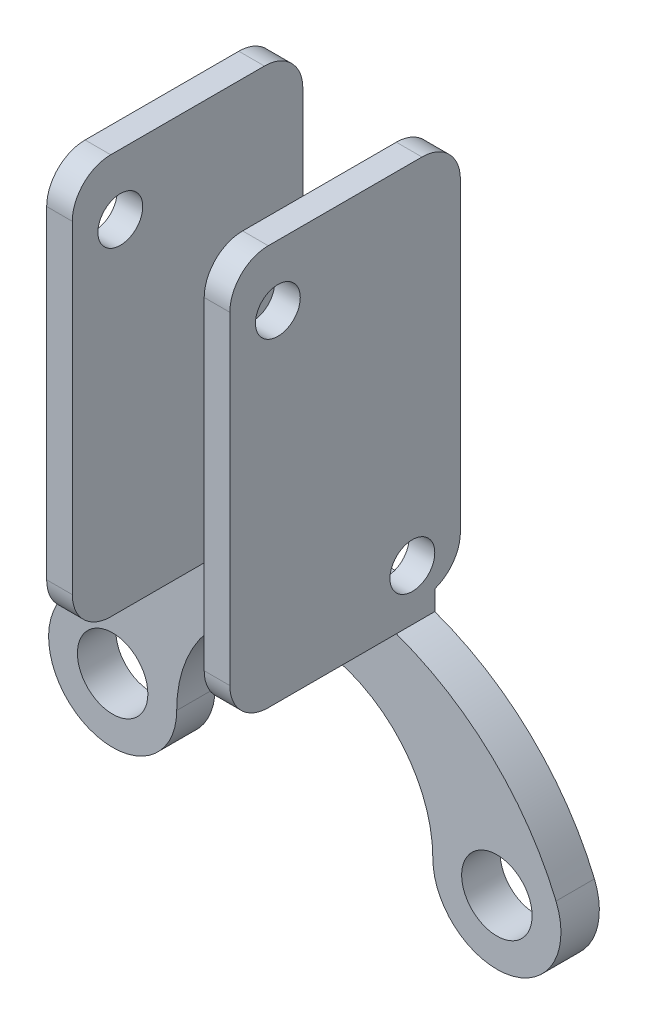
ISO-10303-21;
HEADER;
FILE_DESCRIPTION(('STEP AP214'),'2;1');
FILE_NAME('part.step','',(''),(''),'','','');
FILE_SCHEMA(('AUTOMOTIVE_DESIGN { 1 0 10303 214 1 1 1 1 }'));
ENDSEC;
DATA;
#1=APPLICATION_CONTEXT('core data for automotive mechanical design processes');
#2=APPLICATION_PROTOCOL_DEFINITION('international standard','automotive_design',2000,#1);
#3=PRODUCT_CONTEXT('',#1,'mechanical');
#4=PRODUCT('Part','Part','',(#3));
#5=PRODUCT_RELATED_PRODUCT_CATEGORY('part','',(#4));
#6=PRODUCT_DEFINITION_FORMATION('','',#4);
#7=PRODUCT_DEFINITION_CONTEXT('part definition',#1,'design');
#8=PRODUCT_DEFINITION('design','',#6,#7);
#9=PRODUCT_DEFINITION_SHAPE('','',#8);
#10=(LENGTH_UNIT() NAMED_UNIT(*) SI_UNIT(.MILLI.,.METRE.));
#11=(NAMED_UNIT(*) PLANE_ANGLE_UNIT() SI_UNIT($,.RADIAN.));
#12=(NAMED_UNIT(*) SI_UNIT($,.STERADIAN.) SOLID_ANGLE_UNIT());
#13=UNCERTAINTY_MEASURE_WITH_UNIT(LENGTH_MEASURE(1.E-05),#10,'distance_accuracy_value','');
#14=(GEOMETRIC_REPRESENTATION_CONTEXT(3) GLOBAL_UNCERTAINTY_ASSIGNED_CONTEXT((#13)) GLOBAL_UNIT_ASSIGNED_CONTEXT((#10,
#11,#12)) REPRESENTATION_CONTEXT('',''));
#15=CARTESIAN_POINT('',(0.,0.,0.));
#16=DIRECTION('',(0.,0.,1.));
#17=DIRECTION('',(1.,0.,0.));
#18=AXIS2_PLACEMENT_3D('',#15,#16,#17);
#19=CARTESIAN_POINT('',(0.,0.,0.));
#20=DIRECTION('',(0.,0.,1.));
#21=DIRECTION('',(1.,0.,0.));
#22=AXIS2_PLACEMENT_3D('',#19,#20,#21);
#23=PLANE('',#22);
#24=CARTESIAN_POINT('',(-15.,45.,0.));
#25=DIRECTION('',(0.,0.,1.));
#26=DIRECTION('',(1.,0.,0.));
#27=AXIS2_PLACEMENT_3D('',#24,#25,#26);
#28=CIRCLE('',#27,2.75);
#29=CARTESIAN_POINT('',(-12.25,45.,0.));
#30=VERTEX_POINT('',#29);
#31=EDGE_CURVE('E347',#30,#30,#28,.F.);
#32=ORIENTED_EDGE('',*,*,#31,.F.);
#33=EDGE_LOOP('',(#32));
#34=FACE_BOUND('',#33,.T.);
#35=CARTESIAN_POINT('',(15.,45.,0.));
#36=DIRECTION('',(0.,0.,1.));
#37=DIRECTION('',(1.,0.,0.));
#38=AXIS2_PLACEMENT_3D('',#35,#36,#37);
#39=CIRCLE('',#38,2.75);
#40=CARTESIAN_POINT('',(17.75,45.,0.));
#41=VERTEX_POINT('',#40);
#42=EDGE_CURVE('E343',#41,#41,#39,.F.);
#43=ORIENTED_EDGE('',*,*,#42,.F.);
#44=EDGE_LOOP('',(#43));
#45=FACE_BOUND('',#44,.T.);
#46=DIRECTION('',(-1.,0.,0.));
#47=VECTOR('',#46,1.);
#48=CARTESIAN_POINT('',(-5.15,60.3,0.));
#49=LINE('',#48,#47);
#50=CARTESIAN_POINT('',(-5.15,60.3,0.));
#51=VERTEX_POINT('',#50);
#52=CARTESIAN_POINT('',(-7.15,60.3,0.));
#53=VERTEX_POINT('',#52);
#54=EDGE_CURVE('E202',#51,#53,#49,.T.);
#55=ORIENTED_EDGE('',*,*,#54,.F.);
#56=DIRECTION('',(0.,1.,0.));
#57=VECTOR('',#56,1.);
#58=CARTESIAN_POINT('',(-5.15000000000001,0.,0.));
#59=LINE('',#58,#57);
#60=CARTESIAN_POINT('',(-5.15,60.,0.));
#61=VERTEX_POINT('',#60);
#62=EDGE_CURVE('E205',#61,#51,#59,.T.);
#63=ORIENTED_EDGE('',*,*,#62,.F.);
#64=DIRECTION('',(-1.,0.,0.));
#65=VECTOR('',#64,1.);
#66=CARTESIAN_POINT('',(0.,60.,0.));
#67=LINE('',#66,#65);
#68=CARTESIAN_POINT('',(5.15,60.,0.));
#69=VERTEX_POINT('',#68);
#70=EDGE_CURVE('E222',#69,#61,#67,.T.);
#71=ORIENTED_EDGE('',*,*,#70,.F.);
#72=DIRECTION('',(0.,1.,0.));
#73=VECTOR('',#72,1.);
#74=CARTESIAN_POINT('',(5.14999999999999,0.,0.));
#75=LINE('',#74,#73);
#76=CARTESIAN_POINT('',(5.14999999999999,60.3,0.));
#77=VERTEX_POINT('',#76);
#78=EDGE_CURVE('E362',#69,#77,#75,.T.);
#79=ORIENTED_EDGE('',*,*,#78,.T.);
#80=DIRECTION('',(-1.,0.,0.));
#81=VECTOR('',#80,1.);
#82=CARTESIAN_POINT('',(7.15,60.3,0.));
#83=LINE('',#82,#81);
#84=CARTESIAN_POINT('',(7.15,60.3,0.));
#85=VERTEX_POINT('',#84);
#86=EDGE_CURVE('E416',#85,#77,#83,.T.);
#87=ORIENTED_EDGE('',*,*,#86,.F.);
#88=DIRECTION('',(0.,1.,0.));
#89=VECTOR('',#88,1.);
#90=CARTESIAN_POINT('',(7.15,0.,0.));
#91=LINE('',#90,#89);
#92=CARTESIAN_POINT('',(7.15,58.7609969766626,0.));
#93=VERTEX_POINT('',#92);
#94=EDGE_CURVE('E365',#93,#85,#91,.T.);
#95=ORIENTED_EDGE('',*,*,#94,.F.);
#96=CARTESIAN_POINT('',(0.,38.75,0.));
#97=DIRECTION('',(0.,0.,1.));
#98=DIRECTION('',(1.,0.,0.));
#99=AXIS2_PLACEMENT_3D('',#96,#97,#98);
#100=CIRCLE('',#99,21.25);
#101=CARTESIAN_POINT('',(19.6153846153846,46.9230769230769,0.));
#102=VERTEX_POINT('',#101);
#103=EDGE_CURVE('E368',#102,#93,#100,.T.);
#104=ORIENTED_EDGE('',*,*,#103,.F.);
#105=CARTESIAN_POINT('',(15.,45.,0.));
#106=DIRECTION('',(0.,0.,1.));
#107=DIRECTION('',(1.,0.,0.));
#108=AXIS2_PLACEMENT_3D('',#105,#106,#107);
#109=CIRCLE('',#108,5.);
#110=CARTESIAN_POINT('',(10.,45.,0.));
#111=VERTEX_POINT('',#110);
#112=EDGE_CURVE('E350',#111,#102,#109,.T.);
#113=ORIENTED_EDGE('',*,*,#112,.F.);
#114=CARTESIAN_POINT('',(0.,45.,0.));
#115=DIRECTION('',(0.,0.,1.));
#116=DIRECTION('',(1.,0.,0.));
#117=AXIS2_PLACEMENT_3D('',#114,#115,#116);
#118=CIRCLE('',#117,10.);
#119=CARTESIAN_POINT('',(-10.,45.,0.));
#120=VERTEX_POINT('',#119);
#121=EDGE_CURVE('E352',#111,#120,#118,.T.);
#122=ORIENTED_EDGE('',*,*,#121,.T.);
#123=CARTESIAN_POINT('',(-15.,45.,0.));
#124=DIRECTION('',(0.,0.,1.));
#125=DIRECTION('',(1.,0.,0.));
#126=AXIS2_PLACEMENT_3D('',#123,#124,#125);
#127=CIRCLE('',#126,5.);
#128=CARTESIAN_POINT('',(-19.6153846153846,46.9230769230769,0.));
#129=VERTEX_POINT('',#128);
#130=EDGE_CURVE('E355',#129,#120,#127,.T.);
#131=ORIENTED_EDGE('',*,*,#130,.F.);
#132=CARTESIAN_POINT('',(0.,38.75,0.));
#133=DIRECTION('',(0.,0.,1.));
#134=DIRECTION('',(1.,0.,0.));
#135=AXIS2_PLACEMENT_3D('',#132,#133,#134);
#136=CIRCLE('',#135,21.25);
#137=CARTESIAN_POINT('',(-7.15,58.7609969766626,0.));
#138=VERTEX_POINT('',#137);
#139=EDGE_CURVE('E358',#138,#129,#136,.T.);
#140=ORIENTED_EDGE('',*,*,#139,.F.);
#141=DIRECTION('',(0.,-1.,0.));
#142=VECTOR('',#141,1.);
#143=CARTESIAN_POINT('',(-7.15,0.,0.));
#144=LINE('',#143,#142);
#145=EDGE_CURVE('E207',#53,#138,#144,.T.);
#146=ORIENTED_EDGE('',*,*,#145,.F.);
#147=EDGE_LOOP('',(#55,#63,#71,#79,#87,#95,#104,#113,#122,#131,#140,#146));
#148=FACE_BOUND('',#147,.T.);
#149=ADVANCED_FACE('F35',(#34,#45,#148),#23,.F.);
#150=CARTESIAN_POINT('',(0.,0.,3.));
#151=DIRECTION('',(0.,0.,1.));
#152=DIRECTION('',(1.,0.,0.));
#153=AXIS2_PLACEMENT_3D('',#150,#151,#152);
#154=PLANE('',#153);
#155=CARTESIAN_POINT('',(-15.,45.,3.));
#156=DIRECTION('',(0.,0.,1.));
#157=DIRECTION('',(1.,0.,0.));
#158=AXIS2_PLACEMENT_3D('',#155,#156,#157);
#159=CIRCLE('',#158,2.75);
#160=CARTESIAN_POINT('',(-12.25,45.,3.));
#161=VERTEX_POINT('',#160);
#162=EDGE_CURVE('E374',#161,#161,#159,.F.);
#163=ORIENTED_EDGE('',*,*,#162,.T.);
#164=EDGE_LOOP('',(#163));
#165=FACE_BOUND('',#164,.T.);
#166=CARTESIAN_POINT('',(15.,45.,3.));
#167=DIRECTION('',(0.,0.,1.));
#168=DIRECTION('',(1.,0.,0.));
#169=AXIS2_PLACEMENT_3D('',#166,#167,#168);
#170=CIRCLE('',#169,2.75);
#171=CARTESIAN_POINT('',(17.75,45.,3.));
#172=VERTEX_POINT('',#171);
#173=EDGE_CURVE('E342',#172,#172,#170,.F.);
#174=ORIENTED_EDGE('',*,*,#173,.T.);
#175=EDGE_LOOP('',(#174));
#176=FACE_BOUND('',#175,.T.);
#177=DIRECTION('',(1.,0.,0.));
#178=VECTOR('',#177,1.);
#179=CARTESIAN_POINT('',(7.15,58.7609969766626,3.));
#180=LINE('',#179,#178);
#181=CARTESIAN_POINT('',(5.15,58.7609969766626,3.));
#182=VERTEX_POINT('',#181);
#183=CARTESIAN_POINT('',(7.15,58.7609969766626,3.));
#184=VERTEX_POINT('',#183);
#185=EDGE_CURVE('E408',#182,#184,#180,.T.);
#186=ORIENTED_EDGE('',*,*,#185,.F.);
#187=DIRECTION('',(0.,1.,0.));
#188=VECTOR('',#187,1.);
#189=CARTESIAN_POINT('',(5.15,0.,3.));
#190=LINE('',#189,#188);
#191=CARTESIAN_POINT('',(5.15,60.,3.));
#192=VERTEX_POINT('',#191);
#193=EDGE_CURVE('E304',#182,#192,#190,.T.);
#194=ORIENTED_EDGE('',*,*,#193,.T.);
#195=DIRECTION('',(-1.,0.,0.));
#196=VECTOR('',#195,1.);
#197=CARTESIAN_POINT('',(0.,60.,3.));
#198=LINE('',#197,#196);
#199=CARTESIAN_POINT('',(-5.15,60.,3.));
#200=VERTEX_POINT('',#199);
#201=EDGE_CURVE('E386',#192,#200,#198,.T.);
#202=ORIENTED_EDGE('',*,*,#201,.T.);
#203=DIRECTION('',(0.,1.,0.));
#204=VECTOR('',#203,1.);
#205=CARTESIAN_POINT('',(-5.15,58.7609969766626,3.));
#206=LINE('',#205,#204);
#207=CARTESIAN_POINT('',(-5.15,58.7609969766626,3.));
#208=VERTEX_POINT('',#207);
#209=EDGE_CURVE('E394',#208,#200,#206,.T.);
#210=ORIENTED_EDGE('',*,*,#209,.F.);
#211=DIRECTION('',(1.,0.,0.));
#212=VECTOR('',#211,1.);
#213=CARTESIAN_POINT('',(-7.15,58.7609969766626,3.));
#214=LINE('',#213,#212);
#215=CARTESIAN_POINT('',(-7.15,58.7609969766626,3.));
#216=VERTEX_POINT('',#215);
#217=EDGE_CURVE('E397',#216,#208,#214,.T.);
#218=ORIENTED_EDGE('',*,*,#217,.F.);
#219=CARTESIAN_POINT('',(0.,38.75,3.));
#220=DIRECTION('',(0.,0.,1.));
#221=DIRECTION('',(1.,0.,0.));
#222=AXIS2_PLACEMENT_3D('',#219,#220,#221);
#223=CIRCLE('',#222,21.25);
#224=CARTESIAN_POINT('',(-19.6153846153846,46.9230769230769,3.));
#225=VERTEX_POINT('',#224);
#226=EDGE_CURVE('E384',#216,#225,#223,.T.);
#227=ORIENTED_EDGE('',*,*,#226,.T.);
#228=CARTESIAN_POINT('',(-15.,45.,3.));
#229=DIRECTION('',(0.,0.,1.));
#230=DIRECTION('',(1.,0.,0.));
#231=AXIS2_PLACEMENT_3D('',#228,#229,#230);
#232=CIRCLE('',#231,5.);
#233=CARTESIAN_POINT('',(-10.,45.,3.));
#234=VERTEX_POINT('',#233);
#235=EDGE_CURVE('E382',#225,#234,#232,.T.);
#236=ORIENTED_EDGE('',*,*,#235,.T.);
#237=CARTESIAN_POINT('',(0.,45.,3.));
#238=DIRECTION('',(0.,0.,1.));
#239=DIRECTION('',(1.,0.,0.));
#240=AXIS2_PLACEMENT_3D('',#237,#238,#239);
#241=CIRCLE('',#240,10.);
#242=CARTESIAN_POINT('',(10.,45.,3.));
#243=VERTEX_POINT('',#242);
#244=EDGE_CURVE('E379',#243,#234,#241,.T.);
#245=ORIENTED_EDGE('',*,*,#244,.F.);
#246=CARTESIAN_POINT('',(15.,45.,3.));
#247=DIRECTION('',(0.,0.,1.));
#248=DIRECTION('',(1.,0.,0.));
#249=AXIS2_PLACEMENT_3D('',#246,#247,#248);
#250=CIRCLE('',#249,5.);
#251=CARTESIAN_POINT('',(19.6153846153846,46.9230769230769,3.));
#252=VERTEX_POINT('',#251);
#253=EDGE_CURVE('E377',#243,#252,#250,.T.);
#254=ORIENTED_EDGE('',*,*,#253,.T.);
#255=CARTESIAN_POINT('',(0.,38.75,3.));
#256=DIRECTION('',(0.,0.,1.));
#257=DIRECTION('',(1.,0.,0.));
#258=AXIS2_PLACEMENT_3D('',#255,#256,#257);
#259=CIRCLE('',#258,21.25);
#260=EDGE_CURVE('E346',#252,#184,#259,.T.);
#261=ORIENTED_EDGE('',*,*,#260,.T.);
#262=EDGE_LOOP('',(#186,#194,#202,#210,#218,#227,#236,#245,#254,#261));
#263=FACE_BOUND('',#262,.T.);
#264=ADVANCED_FACE('F490',(#165,#176,#263),#154,.T.);
#265=CARTESIAN_POINT('',(0.,38.75,3.));
#266=DIRECTION('',(0.,0.,-1.));
#267=DIRECTION('',(-1.,0.,0.));
#268=AXIS2_PLACEMENT_3D('',#265,#266,#267);
#269=CYLINDRICAL_SURFACE('',#268,21.25);
#270=ORIENTED_EDGE('',*,*,#103,.T.);
#271=DIRECTION('',(0.,0.,-1.));
#272=VECTOR('',#271,1.);
#273=CARTESIAN_POINT('',(7.15,58.7609969766626,3.));
#274=LINE('',#273,#272);
#275=EDGE_CURVE('E316',#184,#93,#274,.T.);
#276=ORIENTED_EDGE('',*,*,#275,.F.);
#277=ORIENTED_EDGE('',*,*,#260,.F.);
#278=DIRECTION('',(0.,0.,-1.));
#279=VECTOR('',#278,1.);
#280=CARTESIAN_POINT('',(19.6153846153846,46.9230769230769,3.));
#281=LINE('',#280,#279);
#282=EDGE_CURVE('E339',#252,#102,#281,.T.);
#283=ORIENTED_EDGE('',*,*,#282,.T.);
#284=EDGE_LOOP('',(#270,#276,#277,#283));
#285=FACE_BOUND('',#284,.T.);
#286=ADVANCED_FACE('F448',(#285),#269,.T.);
#287=CARTESIAN_POINT('',(7.15,0.,3.));
#288=DIRECTION('',(-1.,0.,0.));
#289=DIRECTION('',(0.,0.,1.));
#290=AXIS2_PLACEMENT_3D('',#287,#288,#289);
#291=PLANE('',#290);
#292=CARTESIAN_POINT('',(7.15,62.7499999999999,1.74999999999999));
#293=DIRECTION('',(1.,0.,0.));
#294=DIRECTION('',(0.,0.,-1.));
#295=AXIS2_PLACEMENT_3D('',#292,#293,#294);
#296=CIRCLE('',#295,1.75);
#297=CARTESIAN_POINT('',(7.15,62.7499999999999,0.));
#298=VERTEX_POINT('',#297);
#299=EDGE_CURVE('E314',#298,#298,#296,.T.);
#300=ORIENTED_EDGE('',*,*,#299,.F.);
#301=EDGE_LOOP('',(#300));
#302=FACE_BOUND('',#301,.T.);
#303=CARTESIAN_POINT('',(7.15,85.2499999999999,12.25));
#304=DIRECTION('',(1.,0.,0.));
#305=DIRECTION('',(0.,0.,-1.));
#306=AXIS2_PLACEMENT_3D('',#303,#304,#305);
#307=CIRCLE('',#306,1.75);
#308=CARTESIAN_POINT('',(7.15,85.2499999999999,10.5));
#309=VERTEX_POINT('',#308);
#310=EDGE_CURVE('E436',#309,#309,#307,.T.);
#311=ORIENTED_EDGE('',*,*,#310,.F.);
#312=EDGE_LOOP('',(#311));
#313=FACE_BOUND('',#312,.T.);
#314=ORIENTED_EDGE('',*,*,#94,.T.);
#315=CARTESIAN_POINT('',(7.15,63.1284271247462,1.));
#316=DIRECTION('',(-1.,0.,0.));
#317=DIRECTION('',(0.,0.,1.));
#318=AXIS2_PLACEMENT_3D('',#315,#316,#317);
#319=CIRCLE('',#318,3.);
#320=CARTESIAN_POINT('',(7.15,63.1284271247462,-2.));
#321=VERTEX_POINT('',#320);
#322=EDGE_CURVE('E252',#85,#321,#319,.F.);
#323=ORIENTED_EDGE('',*,*,#322,.T.);
#324=DIRECTION('',(0.,-1.,0.));
#325=VECTOR('',#324,1.);
#326=CARTESIAN_POINT('',(7.15,90.,-2.));
#327=LINE('',#326,#325);
#328=CARTESIAN_POINT('',(7.15,87.,-2.));
#329=VERTEX_POINT('',#328);
#330=EDGE_CURVE('E419',#329,#321,#327,.T.);
#331=ORIENTED_EDGE('',*,*,#330,.F.);
#332=CARTESIAN_POINT('',(7.15,87.,1.));
#333=DIRECTION('',(-1.,0.,0.));
#334=DIRECTION('',(0.,0.,1.));
#335=AXIS2_PLACEMENT_3D('',#332,#333,#334);
#336=CIRCLE('',#335,3.);
#337=CARTESIAN_POINT('',(7.15,90.,1.));
#338=VERTEX_POINT('',#337);
#339=EDGE_CURVE('E249',#329,#338,#336,.F.);
#340=ORIENTED_EDGE('',*,*,#339,.T.);
#341=DIRECTION('',(0.,0.,-1.));
#342=VECTOR('',#341,1.);
#343=CARTESIAN_POINT('',(7.15,90.,3.));
#344=LINE('',#343,#342);
#345=CARTESIAN_POINT('',(7.15,90.,13.));
#346=VERTEX_POINT('',#345);
#347=EDGE_CURVE('E319',#346,#338,#344,.T.);
#348=ORIENTED_EDGE('',*,*,#347,.F.);
#349=CARTESIAN_POINT('',(7.15,87.,13.));
#350=DIRECTION('',(-1.,0.,0.));
#351=DIRECTION('',(0.,0.,1.));
#352=AXIS2_PLACEMENT_3D('',#349,#350,#351);
#353=CIRCLE('',#352,3.);
#354=CARTESIAN_POINT('',(7.15,87.,16.));
#355=VERTEX_POINT('',#354);
#356=EDGE_CURVE('E56',#346,#355,#353,.F.);
#357=ORIENTED_EDGE('',*,*,#356,.T.);
#358=DIRECTION('',(0.,1.,0.));
#359=VECTOR('',#358,1.);
#360=CARTESIAN_POINT('',(7.15,58.7609969766626,16.));
#361=LINE('',#360,#359);
#362=CARTESIAN_POINT('',(7.15,61.7609969766626,16.));
#363=VERTEX_POINT('',#362);
#364=EDGE_CURVE('E411',#363,#355,#361,.T.);
#365=ORIENTED_EDGE('',*,*,#364,.F.);
#366=CARTESIAN_POINT('',(7.15,61.7609969766626,13.));
#367=DIRECTION('',(-1.,0.,0.));
#368=DIRECTION('',(0.,0.,1.));
#369=AXIS2_PLACEMENT_3D('',#366,#367,#368);
#370=CIRCLE('',#369,3.);
#371=CARTESIAN_POINT('',(7.15,58.7609969766626,13.));
#372=VERTEX_POINT('',#371);
#373=EDGE_CURVE('E50',#363,#372,#370,.F.);
#374=ORIENTED_EDGE('',*,*,#373,.T.);
#375=DIRECTION('',(0.,0.,-1.));
#376=VECTOR('',#375,1.);
#377=CARTESIAN_POINT('',(7.15,58.7609969766626,16.));
#378=LINE('',#377,#376);
#379=EDGE_CURVE('E405',#372,#184,#378,.T.);
#380=ORIENTED_EDGE('',*,*,#379,.T.);
#381=ORIENTED_EDGE('',*,*,#275,.T.);
#382=EDGE_LOOP('',(#314,#323,#331,#340,#348,#357,#365,#374,#380,#381));
#383=FACE_BOUND('',#382,.T.);
#384=ADVANCED_FACE('F444',(#302,#313,#383),#291,.F.);
#385=CARTESIAN_POINT('',(0.,90.,3.));
#386=DIRECTION('',(0.,1.,0.));
#387=DIRECTION('',(0.,0.,1.));
#388=AXIS2_PLACEMENT_3D('',#385,#386,#387);
#389=PLANE('',#388);
#390=ORIENTED_EDGE('',*,*,#347,.T.);
#391=DIRECTION('',(1.,0.,0.));
#392=VECTOR('',#391,1.);
#393=CARTESIAN_POINT('',(0.,90.,1.));
#394=LINE('',#393,#392);
#395=CARTESIAN_POINT('',(5.15,90.,1.));
#396=VERTEX_POINT('',#395);
#397=EDGE_CURVE('E272',#338,#396,#394,.F.);
#398=ORIENTED_EDGE('',*,*,#397,.T.);
#399=DIRECTION('',(0.,0.,-1.));
#400=VECTOR('',#399,1.);
#401=CARTESIAN_POINT('',(5.15,90.,3.));
#402=LINE('',#401,#400);
#403=CARTESIAN_POINT('',(5.15,90.,13.));
#404=VERTEX_POINT('',#403);
#405=EDGE_CURVE('E322',#404,#396,#402,.T.);
#406=ORIENTED_EDGE('',*,*,#405,.F.);
#407=DIRECTION('',(-1.,0.,0.));
#408=VECTOR('',#407,1.);
#409=CARTESIAN_POINT('',(0.,90.,13.));
#410=LINE('',#409,#408);
#411=EDGE_CURVE('E270',#404,#346,#410,.F.);
#412=ORIENTED_EDGE('',*,*,#411,.T.);
#413=EDGE_LOOP('',(#390,#398,#406,#412));
#414=FACE_BOUND('',#413,.T.);
#415=ADVANCED_FACE('F447',(#414),#389,.T.);
#416=CARTESIAN_POINT('',(5.14999999999999,0.,3.));
#417=DIRECTION('',(-1.,0.,0.));
#418=DIRECTION('',(0.,-1.,0.));
#419=AXIS2_PLACEMENT_3D('',#416,#417,#418);
#420=PLANE('',#419);
#421=CARTESIAN_POINT('',(5.15,62.7499999999999,1.74999999999999));
#422=DIRECTION('',(-1.,0.,0.));
#423=DIRECTION('',(0.,-1.,0.));
#424=AXIS2_PLACEMENT_3D('',#421,#422,#423);
#425=CIRCLE('',#424,1.75);
#426=CARTESIAN_POINT('',(5.15,60.9999999999999,1.74999999999999));
#427=VERTEX_POINT('',#426);
#428=EDGE_CURVE('E211',#427,#427,#425,.T.);
#429=ORIENTED_EDGE('',*,*,#428,.F.);
#430=EDGE_LOOP('',(#429));
#431=FACE_BOUND('',#430,.T.);
#432=CARTESIAN_POINT('',(5.15,85.2499999999999,12.25));
#433=DIRECTION('',(-1.,0.,0.));
#434=DIRECTION('',(0.,-1.,0.));
#435=AXIS2_PLACEMENT_3D('',#432,#433,#434);
#436=CIRCLE('',#435,1.75);
#437=CARTESIAN_POINT('',(5.15,83.4999999999999,12.25));
#438=VERTEX_POINT('',#437);
#439=EDGE_CURVE('E309',#438,#438,#436,.T.);
#440=ORIENTED_EDGE('',*,*,#439,.F.);
#441=EDGE_LOOP('',(#440));
#442=FACE_BOUND('',#441,.T.);
#443=DIRECTION('',(0.,1.,0.));
#444=VECTOR('',#443,1.);
#445=CARTESIAN_POINT('',(5.15,90.,-2.));
#446=LINE('',#445,#444);
#447=CARTESIAN_POINT('',(5.15,63.1284271247462,-2.));
#448=VERTEX_POINT('',#447);
#449=CARTESIAN_POINT('',(5.15,87.,-2.));
#450=VERTEX_POINT('',#449);
#451=EDGE_CURVE('E412',#448,#450,#446,.T.);
#452=ORIENTED_EDGE('',*,*,#451,.F.);
#453=CARTESIAN_POINT('',(5.15,63.1284271247462,1.));
#454=DIRECTION('',(-1.,0.,0.));
#455=DIRECTION('',(0.,-1.,0.));
#456=AXIS2_PLACEMENT_3D('',#453,#454,#455);
#457=CIRCLE('',#456,3.);
#458=EDGE_CURVE('E246',#448,#77,#457,.T.);
#459=ORIENTED_EDGE('',*,*,#458,.T.);
#460=ORIENTED_EDGE('',*,*,#78,.F.);
#461=DIRECTION('',(0.,0.,-1.));
#462=VECTOR('',#461,1.);
#463=CARTESIAN_POINT('',(5.15,60.,3.));
#464=LINE('',#463,#462);
#465=EDGE_CURVE('E325',#192,#69,#464,.T.);
#466=ORIENTED_EDGE('',*,*,#465,.F.);
#467=ORIENTED_EDGE('',*,*,#193,.F.);
#468=DIRECTION('',(0.,0.,-1.));
#469=VECTOR('',#468,1.);
#470=CARTESIAN_POINT('',(5.15,58.7609969766626,16.));
#471=LINE('',#470,#469);
#472=CARTESIAN_POINT('',(5.15,58.7609969766626,13.));
#473=VERTEX_POINT('',#472);
#474=EDGE_CURVE('E400',#473,#182,#471,.T.);
#475=ORIENTED_EDGE('',*,*,#474,.F.);
#476=CARTESIAN_POINT('',(5.15,61.7609969766626,13.));
#477=DIRECTION('',(-1.,0.,0.));
#478=DIRECTION('',(0.,-1.,0.));
#479=AXIS2_PLACEMENT_3D('',#476,#477,#478);
#480=CIRCLE('',#479,3.);
#481=CARTESIAN_POINT('',(5.15,61.7609969766626,16.));
#482=VERTEX_POINT('',#481);
#483=EDGE_CURVE('E244',#473,#482,#480,.T.);
#484=ORIENTED_EDGE('',*,*,#483,.T.);
#485=DIRECTION('',(0.,-1.,0.));
#486=VECTOR('',#485,1.);
#487=CARTESIAN_POINT('',(5.15,58.7609969766626,16.));
#488=LINE('',#487,#486);
#489=CARTESIAN_POINT('',(5.15,87.,16.));
#490=VERTEX_POINT('',#489);
#491=EDGE_CURVE('E407',#490,#482,#488,.T.);
#492=ORIENTED_EDGE('',*,*,#491,.F.);
#493=CARTESIAN_POINT('',(5.15,87.,13.));
#494=DIRECTION('',(-1.,0.,0.));
#495=DIRECTION('',(0.,-1.,0.));
#496=AXIS2_PLACEMENT_3D('',#493,#494,#495);
#497=CIRCLE('',#496,3.);
#498=EDGE_CURVE('E240',#490,#404,#497,.T.);
#499=ORIENTED_EDGE('',*,*,#498,.T.);
#500=ORIENTED_EDGE('',*,*,#405,.T.);
#501=CARTESIAN_POINT('',(5.15,87.,1.));
#502=DIRECTION('',(-1.,0.,0.));
#503=DIRECTION('',(0.,-1.,0.));
#504=AXIS2_PLACEMENT_3D('',#501,#502,#503);
#505=CIRCLE('',#504,3.);
#506=EDGE_CURVE('E242',#396,#450,#505,.T.);
#507=ORIENTED_EDGE('',*,*,#506,.T.);
#508=EDGE_LOOP('',(#452,#459,#460,#466,#467,#475,#484,#492,#499,#500,#507));
#509=FACE_BOUND('',#508,.T.);
#510=ADVANCED_FACE('F463',(#431,#442,#509),#420,.T.);
#511=CARTESIAN_POINT('',(0.,60.,3.));
#512=DIRECTION('',(0.,-1.,0.));
#513=DIRECTION('',(0.,0.,-1.));
#514=AXIS2_PLACEMENT_3D('',#511,#512,#513);
#515=PLANE('',#514);
#516=ORIENTED_EDGE('',*,*,#70,.T.);
#517=DIRECTION('',(0.,0.,-1.));
#518=VECTOR('',#517,1.);
#519=CARTESIAN_POINT('',(-5.15,60.,3.));
#520=LINE('',#519,#518);
#521=EDGE_CURVE('E221',#200,#61,#520,.T.);
#522=ORIENTED_EDGE('',*,*,#521,.F.);
#523=ORIENTED_EDGE('',*,*,#201,.F.);
#524=ORIENTED_EDGE('',*,*,#465,.T.);
#525=EDGE_LOOP('',(#516,#522,#523,#524));
#526=FACE_BOUND('',#525,.T.);
#527=ADVANCED_FACE('F577',(#526),#515,.F.);
#528=CARTESIAN_POINT('',(-5.15000000000001,0.,3.));
#529=DIRECTION('',(-1.,0.,0.));
#530=DIRECTION('',(0.,-1.,0.));
#531=AXIS2_PLACEMENT_3D('',#528,#529,#530);
#532=PLANE('',#531);
#533=CARTESIAN_POINT('',(-5.15,62.7499999999999,1.74999999999999));
#534=DIRECTION('',(-1.,0.,0.));
#535=DIRECTION('',(0.,-1.,0.));
#536=AXIS2_PLACEMENT_3D('',#533,#534,#535);
#537=CIRCLE('',#536,1.75);
#538=CARTESIAN_POINT('',(-5.15,60.9999999999999,1.74999999999999));
#539=VERTEX_POINT('',#538);
#540=EDGE_CURVE('E308',#539,#539,#537,.T.);
#541=ORIENTED_EDGE('',*,*,#540,.T.);
#542=EDGE_LOOP('',(#541));
#543=FACE_BOUND('',#542,.T.);
#544=CARTESIAN_POINT('',(-5.15,85.2499999999999,12.25));
#545=DIRECTION('',(-1.,0.,0.));
#546=DIRECTION('',(0.,-1.,0.));
#547=AXIS2_PLACEMENT_3D('',#544,#545,#546);
#548=CIRCLE('',#547,1.75);
#549=CARTESIAN_POINT('',(-5.15,83.4999999999999,12.25));
#550=VERTEX_POINT('',#549);
#551=EDGE_CURVE('E313',#550,#550,#548,.T.);
#552=ORIENTED_EDGE('',*,*,#551,.T.);
#553=EDGE_LOOP('',(#552));
#554=FACE_BOUND('',#553,.T.);
#555=ORIENTED_EDGE('',*,*,#62,.T.);
#556=CARTESIAN_POINT('',(-5.15,63.1284271247462,1.));
#557=DIRECTION('',(-1.,0.,0.));
#558=DIRECTION('',(0.,-1.,0.));
#559=AXIS2_PLACEMENT_3D('',#556,#557,#558);
#560=CIRCLE('',#559,3.);
#561=CARTESIAN_POINT('',(-5.15,63.1284271247462,-2.));
#562=VERTEX_POINT('',#561);
#563=EDGE_CURVE('E217',#51,#562,#560,.F.);
#564=ORIENTED_EDGE('',*,*,#563,.T.);
#565=DIRECTION('',(0.,-1.,0.));
#566=VECTOR('',#565,1.);
#567=CARTESIAN_POINT('',(-5.15,60.3,-2.));
#568=LINE('',#567,#566);
#569=CARTESIAN_POINT('',(-5.15,87.,-2.));
#570=VERTEX_POINT('',#569);
#571=EDGE_CURVE('E210',#570,#562,#568,.T.);
#572=ORIENTED_EDGE('',*,*,#571,.F.);
#573=CARTESIAN_POINT('',(-5.15,87.,1.));
#574=DIRECTION('',(-1.,0.,0.));
#575=DIRECTION('',(0.,-1.,0.));
#576=AXIS2_PLACEMENT_3D('',#573,#574,#575);
#577=CIRCLE('',#576,3.);
#578=CARTESIAN_POINT('',(-5.15,90.,1.));
#579=VERTEX_POINT('',#578);
#580=EDGE_CURVE('E234',#570,#579,#577,.F.);
#581=ORIENTED_EDGE('',*,*,#580,.T.);
#582=DIRECTION('',(0.,0.,-1.));
#583=VECTOR('',#582,1.);
#584=CARTESIAN_POINT('',(-5.15,90.,3.));
#585=LINE('',#584,#583);
#586=CARTESIAN_POINT('',(-5.15,90.,13.));
#587=VERTEX_POINT('',#586);
#588=EDGE_CURVE('E279',#587,#579,#585,.T.);
#589=ORIENTED_EDGE('',*,*,#588,.F.);
#590=CARTESIAN_POINT('',(-5.15,87.,13.));
#591=DIRECTION('',(-1.,0.,0.));
#592=DIRECTION('',(0.,-1.,0.));
#593=AXIS2_PLACEMENT_3D('',#590,#591,#592);
#594=CIRCLE('',#593,3.);
#595=CARTESIAN_POINT('',(-5.15,87.,16.));
#596=VERTEX_POINT('',#595);
#597=EDGE_CURVE('E286',#587,#596,#594,.F.);
#598=ORIENTED_EDGE('',*,*,#597,.T.);
#599=DIRECTION('',(0.,1.,0.));
#600=VECTOR('',#599,1.);
#601=CARTESIAN_POINT('',(-5.15,58.7609969766626,16.));
#602=LINE('',#601,#600);
#603=CARTESIAN_POINT('',(-5.15,61.7609969766626,16.));
#604=VERTEX_POINT('',#603);
#605=EDGE_CURVE('E393',#604,#596,#602,.T.);
#606=ORIENTED_EDGE('',*,*,#605,.F.);
#607=CARTESIAN_POINT('',(-5.15,61.7609969766626,13.));
#608=DIRECTION('',(-1.,0.,0.));
#609=DIRECTION('',(0.,-1.,0.));
#610=AXIS2_PLACEMENT_3D('',#607,#608,#609);
#611=CIRCLE('',#610,3.);
#612=CARTESIAN_POINT('',(-5.15,58.7609969766626,13.));
#613=VERTEX_POINT('',#612);
#614=EDGE_CURVE('E229',#604,#613,#611,.F.);
#615=ORIENTED_EDGE('',*,*,#614,.T.);
#616=DIRECTION('',(0.,0.,-1.));
#617=VECTOR('',#616,1.);
#618=CARTESIAN_POINT('',(-5.15,58.7609969766626,16.));
#619=LINE('',#618,#617);
#620=EDGE_CURVE('E391',#613,#208,#619,.T.);
#621=ORIENTED_EDGE('',*,*,#620,.T.);
#622=ORIENTED_EDGE('',*,*,#209,.T.);
#623=ORIENTED_EDGE('',*,*,#521,.T.);
#624=EDGE_LOOP('',(#555,#564,#572,#581,#589,#598,#606,#615,#621,#622,#623));
#625=FACE_BOUND('',#624,.T.);
#626=ADVANCED_FACE('F215',(#543,#554,#625),#532,.F.);
#627=CARTESIAN_POINT('',(0.,90.,3.));
#628=DIRECTION('',(0.,-1.,0.));
#629=DIRECTION('',(0.,0.,-1.));
#630=AXIS2_PLACEMENT_3D('',#627,#628,#629);
#631=PLANE('',#630);
#632=ORIENTED_EDGE('',*,*,#588,.T.);
#633=DIRECTION('',(1.,0.,0.));
#634=VECTOR('',#633,1.);
#635=CARTESIAN_POINT('',(0.,90.,1.));
#636=LINE('',#635,#634);
#637=CARTESIAN_POINT('',(-7.15,90.,1.));
#638=VERTEX_POINT('',#637);
#639=EDGE_CURVE('E11',#579,#638,#636,.F.);
#640=ORIENTED_EDGE('',*,*,#639,.T.);
#641=DIRECTION('',(0.,0.,-1.));
#642=VECTOR('',#641,1.);
#643=CARTESIAN_POINT('',(-7.15,90.,3.));
#644=LINE('',#643,#642);
#645=CARTESIAN_POINT('',(-7.15,90.,13.));
#646=VERTEX_POINT('',#645);
#647=EDGE_CURVE('E282',#646,#638,#644,.T.);
#648=ORIENTED_EDGE('',*,*,#647,.F.);
#649=DIRECTION('',(-1.,0.,0.));
#650=VECTOR('',#649,1.);
#651=CARTESIAN_POINT('',(0.,90.,13.));
#652=LINE('',#651,#650);
#653=EDGE_CURVE('E43',#646,#587,#652,.F.);
#654=ORIENTED_EDGE('',*,*,#653,.T.);
#655=EDGE_LOOP('',(#632,#640,#648,#654));
#656=FACE_BOUND('',#655,.T.);
#657=ADVANCED_FACE('F278',(#656),#631,.F.);
#658=CARTESIAN_POINT('',(-7.15,0.,3.));
#659=DIRECTION('',(1.,0.,0.));
#660=DIRECTION('',(0.,0.,-1.));
#661=AXIS2_PLACEMENT_3D('',#658,#659,#660);
#662=PLANE('',#661);
#663=CARTESIAN_POINT('',(-7.15,62.7499999999999,1.74999999999999));
#664=DIRECTION('',(1.,0.,0.));
#665=DIRECTION('',(0.,0.,-1.));
#666=AXIS2_PLACEMENT_3D('',#663,#664,#665);
#667=CIRCLE('',#666,1.75);
#668=CARTESIAN_POINT('',(-7.15,62.7499999999999,0.));
#669=VERTEX_POINT('',#668);
#670=EDGE_CURVE('E305',#669,#669,#667,.T.);
#671=ORIENTED_EDGE('',*,*,#670,.T.);
#672=EDGE_LOOP('',(#671));
#673=FACE_BOUND('',#672,.T.);
#674=CARTESIAN_POINT('',(-7.15,85.2499999999999,12.25));
#675=DIRECTION('',(1.,0.,0.));
#676=DIRECTION('',(0.,0.,-1.));
#677=AXIS2_PLACEMENT_3D('',#674,#675,#676);
#678=CIRCLE('',#677,1.75);
#679=CARTESIAN_POINT('',(-7.15,85.2499999999999,10.5));
#680=VERTEX_POINT('',#679);
#681=EDGE_CURVE('E310',#680,#680,#678,.T.);
#682=ORIENTED_EDGE('',*,*,#681,.T.);
#683=EDGE_LOOP('',(#682));
#684=FACE_BOUND('',#683,.T.);
#685=DIRECTION('',(0.,1.,0.));
#686=VECTOR('',#685,1.);
#687=CARTESIAN_POINT('',(-7.15,60.3,-2.));
#688=LINE('',#687,#686);
#689=CARTESIAN_POINT('',(-7.15,63.1284271247462,-2.));
#690=VERTEX_POINT('',#689);
#691=CARTESIAN_POINT('',(-7.15,87.,-2.));
#692=VERTEX_POINT('',#691);
#693=EDGE_CURVE('E420',#690,#692,#688,.T.);
#694=ORIENTED_EDGE('',*,*,#693,.F.);
#695=CARTESIAN_POINT('',(-7.15,63.1284271247462,1.));
#696=DIRECTION('',(1.,0.,0.));
#697=DIRECTION('',(0.,0.,-1.));
#698=AXIS2_PLACEMENT_3D('',#695,#696,#697);
#699=CIRCLE('',#698,3.);
#700=EDGE_CURVE('E290',#690,#53,#699,.F.);
#701=ORIENTED_EDGE('',*,*,#700,.T.);
#702=ORIENTED_EDGE('',*,*,#145,.T.);
#703=DIRECTION('',(0.,0.,-1.));
#704=VECTOR('',#703,1.);
#705=CARTESIAN_POINT('',(-7.15,58.7609969766626,3.));
#706=LINE('',#705,#704);
#707=EDGE_CURVE('E329',#216,#138,#706,.T.);
#708=ORIENTED_EDGE('',*,*,#707,.F.);
#709=DIRECTION('',(0.,0.,-1.));
#710=VECTOR('',#709,1.);
#711=CARTESIAN_POINT('',(-7.15,58.7609969766626,16.));
#712=LINE('',#711,#710);
#713=CARTESIAN_POINT('',(-7.15,58.7609969766626,13.));
#714=VERTEX_POINT('',#713);
#715=EDGE_CURVE('E371',#714,#216,#712,.T.);
#716=ORIENTED_EDGE('',*,*,#715,.F.);
#717=CARTESIAN_POINT('',(-7.15,61.7609969766626,13.));
#718=DIRECTION('',(1.,0.,0.));
#719=DIRECTION('',(0.,0.,-1.));
#720=AXIS2_PLACEMENT_3D('',#717,#718,#719);
#721=CIRCLE('',#720,3.);
#722=CARTESIAN_POINT('',(-7.15,61.7609969766626,16.));
#723=VERTEX_POINT('',#722);
#724=EDGE_CURVE('E292',#714,#723,#721,.F.);
#725=ORIENTED_EDGE('',*,*,#724,.T.);
#726=DIRECTION('',(0.,-1.,0.));
#727=VECTOR('',#726,1.);
#728=CARTESIAN_POINT('',(-7.15,58.7609969766626,16.));
#729=LINE('',#728,#727);
#730=CARTESIAN_POINT('',(-7.15,87.,16.));
#731=VERTEX_POINT('',#730);
#732=EDGE_CURVE('E396',#731,#723,#729,.T.);
#733=ORIENTED_EDGE('',*,*,#732,.F.);
#734=CARTESIAN_POINT('',(-7.15,87.,13.));
#735=DIRECTION('',(1.,0.,0.));
#736=DIRECTION('',(0.,0.,-1.));
#737=AXIS2_PLACEMENT_3D('',#734,#735,#736);
#738=CIRCLE('',#737,3.);
#739=EDGE_CURVE('E298',#731,#646,#738,.F.);
#740=ORIENTED_EDGE('',*,*,#739,.T.);
#741=ORIENTED_EDGE('',*,*,#647,.T.);
#742=CARTESIAN_POINT('',(-7.15,87.,1.));
#743=DIRECTION('',(1.,0.,0.));
#744=DIRECTION('',(0.,0.,-1.));
#745=AXIS2_PLACEMENT_3D('',#742,#743,#744);
#746=CIRCLE('',#745,3.);
#747=EDGE_CURVE('E296',#638,#692,#746,.F.);
#748=ORIENTED_EDGE('',*,*,#747,.T.);
#749=EDGE_LOOP('',(#694,#701,#702,#708,#716,#725,#733,#740,#741,#748));
#750=FACE_BOUND('',#749,.T.);
#751=ADVANCED_FACE('F513',(#673,#684,#750),#662,.F.);
#752=CARTESIAN_POINT('',(0.,38.75,3.));
#753=DIRECTION('',(0.,0.,-1.));
#754=DIRECTION('',(-1.,0.,0.));
#755=AXIS2_PLACEMENT_3D('',#752,#753,#754);
#756=CYLINDRICAL_SURFACE('',#755,21.25);
#757=ORIENTED_EDGE('',*,*,#139,.T.);
#758=DIRECTION('',(0.,0.,-1.));
#759=VECTOR('',#758,1.);
#760=CARTESIAN_POINT('',(-19.6153846153846,46.9230769230769,3.));
#761=LINE('',#760,#759);
#762=EDGE_CURVE('E332',#225,#129,#761,.T.);
#763=ORIENTED_EDGE('',*,*,#762,.F.);
#764=ORIENTED_EDGE('',*,*,#226,.F.);
#765=ORIENTED_EDGE('',*,*,#707,.T.);
#766=EDGE_LOOP('',(#757,#763,#764,#765));
#767=FACE_BOUND('',#766,.T.);
#768=ADVANCED_FACE('F507',(#767),#756,.T.);
#769=CARTESIAN_POINT('',(-15.,45.,3.));
#770=DIRECTION('',(0.,0.,-1.));
#771=DIRECTION('',(-1.,0.,0.));
#772=AXIS2_PLACEMENT_3D('',#769,#770,#771);
#773=CYLINDRICAL_SURFACE('',#772,5.);
#774=ORIENTED_EDGE('',*,*,#130,.T.);
#775=DIRECTION('',(0.,0.,-1.));
#776=VECTOR('',#775,1.);
#777=CARTESIAN_POINT('',(-10.,45.,3.));
#778=LINE('',#777,#776);
#779=EDGE_CURVE('E335',#234,#120,#778,.T.);
#780=ORIENTED_EDGE('',*,*,#779,.F.);
#781=ORIENTED_EDGE('',*,*,#235,.F.);
#782=ORIENTED_EDGE('',*,*,#762,.T.);
#783=EDGE_LOOP('',(#774,#780,#781,#782));
#784=FACE_BOUND('',#783,.T.);
#785=ADVANCED_FACE('F504',(#784),#773,.T.);
#786=CARTESIAN_POINT('',(0.,45.,3.));
#787=DIRECTION('',(0.,0.,-1.));
#788=DIRECTION('',(-1.,0.,0.));
#789=AXIS2_PLACEMENT_3D('',#786,#787,#788);
#790=CYLINDRICAL_SURFACE('',#789,10.);
#791=ORIENTED_EDGE('',*,*,#121,.F.);
#792=DIRECTION('',(0.,0.,-1.));
#793=VECTOR('',#792,1.);
#794=CARTESIAN_POINT('',(10.,45.,3.));
#795=LINE('',#794,#793);
#796=EDGE_CURVE('E337',#243,#111,#795,.T.);
#797=ORIENTED_EDGE('',*,*,#796,.F.);
#798=ORIENTED_EDGE('',*,*,#244,.T.);
#799=ORIENTED_EDGE('',*,*,#779,.T.);
#800=EDGE_LOOP('',(#791,#797,#798,#799));
#801=FACE_BOUND('',#800,.T.);
#802=ADVANCED_FACE('F500',(#801),#790,.F.);
#803=CARTESIAN_POINT('',(-15.,45.,3.));
#804=DIRECTION('',(0.,0.,-1.));
#805=DIRECTION('',(-1.,0.,0.));
#806=AXIS2_PLACEMENT_3D('',#803,#804,#805);
#807=CYLINDRICAL_SURFACE('',#806,2.75);
#808=ORIENTED_EDGE('',*,*,#162,.F.);
#809=EDGE_LOOP('',(#808));
#810=FACE_BOUND('',#809,.T.);
#811=ORIENTED_EDGE('',*,*,#31,.T.);
#812=EDGE_LOOP('',(#811));
#813=FACE_BOUND('',#812,.T.);
#814=ADVANCED_FACE('F558',(#810,#813),#807,.F.);
#815=CARTESIAN_POINT('',(15.,45.,3.));
#816=DIRECTION('',(0.,0.,-1.));
#817=DIRECTION('',(-1.,0.,0.));
#818=AXIS2_PLACEMENT_3D('',#815,#816,#817);
#819=CYLINDRICAL_SURFACE('',#818,5.);
#820=ORIENTED_EDGE('',*,*,#112,.T.);
#821=ORIENTED_EDGE('',*,*,#282,.F.);
#822=ORIENTED_EDGE('',*,*,#253,.F.);
#823=ORIENTED_EDGE('',*,*,#796,.T.);
#824=EDGE_LOOP('',(#820,#821,#822,#823));
#825=FACE_BOUND('',#824,.T.);
#826=ADVANCED_FACE('F556',(#825),#819,.T.);
#827=CARTESIAN_POINT('',(15.,45.,3.));
#828=DIRECTION('',(0.,0.,-1.));
#829=DIRECTION('',(-1.,0.,0.));
#830=AXIS2_PLACEMENT_3D('',#827,#828,#829);
#831=CYLINDRICAL_SURFACE('',#830,2.75);
#832=ORIENTED_EDGE('',*,*,#173,.F.);
#833=EDGE_LOOP('',(#832));
#834=FACE_BOUND('',#833,.T.);
#835=ORIENTED_EDGE('',*,*,#42,.T.);
#836=EDGE_LOOP('',(#835));
#837=FACE_BOUND('',#836,.T.);
#838=ADVANCED_FACE('F553',(#834,#837),#831,.F.);
#839=CARTESIAN_POINT('',(-7.15,58.7609969766626,16.));
#840=DIRECTION('',(0.,1.,0.));
#841=DIRECTION('',(0.,0.,1.));
#842=AXIS2_PLACEMENT_3D('',#839,#840,#841);
#843=PLANE('',#842);
#844=ORIENTED_EDGE('',*,*,#620,.F.);
#845=DIRECTION('',(1.,0.,0.));
#846=VECTOR('',#845,1.);
#847=CARTESIAN_POINT('',(-7.15,58.7609969766626,13.));
#848=LINE('',#847,#846);
#849=EDGE_CURVE('E268',#613,#714,#848,.F.);
#850=ORIENTED_EDGE('',*,*,#849,.T.);
#851=ORIENTED_EDGE('',*,*,#715,.T.);
#852=ORIENTED_EDGE('',*,*,#217,.T.);
#853=EDGE_LOOP('',(#844,#850,#851,#852));
#854=FACE_BOUND('',#853,.T.);
#855=ADVANCED_FACE('F530',(#854),#843,.F.);
#856=CARTESIAN_POINT('',(0.,0.,16.));
#857=DIRECTION('',(0.,0.,-1.));
#858=DIRECTION('',(-1.,0.,0.));
#859=AXIS2_PLACEMENT_3D('',#856,#857,#858);
#860=PLANE('',#859);
#861=ORIENTED_EDGE('',*,*,#732,.T.);
#862=DIRECTION('',(1.,0.,0.));
#863=VECTOR('',#862,1.);
#864=CARTESIAN_POINT('',(0.,61.7609969766626,16.));
#865=LINE('',#864,#863);
#866=EDGE_CURVE('E265',#723,#604,#865,.T.);
#867=ORIENTED_EDGE('',*,*,#866,.T.);
#868=ORIENTED_EDGE('',*,*,#605,.T.);
#869=DIRECTION('',(-1.,0.,0.));
#870=VECTOR('',#869,1.);
#871=CARTESIAN_POINT('',(0.,87.,16.));
#872=LINE('',#871,#870);
#873=EDGE_CURVE('E262',#596,#731,#872,.T.);
#874=ORIENTED_EDGE('',*,*,#873,.T.);
#875=EDGE_LOOP('',(#861,#867,#868,#874));
#876=FACE_BOUND('',#875,.T.);
#877=ADVANCED_FACE('F523',(#876),#860,.F.);
#878=CARTESIAN_POINT('',(7.15,58.7609969766626,16.));
#879=DIRECTION('',(0.,1.,0.));
#880=DIRECTION('',(0.,0.,1.));
#881=AXIS2_PLACEMENT_3D('',#878,#879,#880);
#882=PLANE('',#881);
#883=ORIENTED_EDGE('',*,*,#379,.F.);
#884=DIRECTION('',(1.,0.,0.));
#885=VECTOR('',#884,1.);
#886=CARTESIAN_POINT('',(5.15,58.7609969766626,13.));
#887=LINE('',#886,#885);
#888=EDGE_CURVE('E260',#372,#473,#887,.F.);
#889=ORIENTED_EDGE('',*,*,#888,.T.);
#890=ORIENTED_EDGE('',*,*,#474,.T.);
#891=ORIENTED_EDGE('',*,*,#185,.T.);
#892=EDGE_LOOP('',(#883,#889,#890,#891));
#893=FACE_BOUND('',#892,.T.);
#894=ADVANCED_FACE('F486',(#893),#882,.F.);
#895=CARTESIAN_POINT('',(0.,0.,16.));
#896=DIRECTION('',(0.,0.,1.));
#897=DIRECTION('',(1.,0.,0.));
#898=AXIS2_PLACEMENT_3D('',#895,#896,#897);
#899=PLANE('',#898);
#900=ORIENTED_EDGE('',*,*,#491,.T.);
#901=DIRECTION('',(1.,0.,0.));
#902=VECTOR('',#901,1.);
#903=CARTESIAN_POINT('',(7.15,61.7609969766626,16.));
#904=LINE('',#903,#902);
#905=EDGE_CURVE('E257',#482,#363,#904,.T.);
#906=ORIENTED_EDGE('',*,*,#905,.T.);
#907=ORIENTED_EDGE('',*,*,#364,.T.);
#908=DIRECTION('',(-1.,0.,0.));
#909=VECTOR('',#908,1.);
#910=CARTESIAN_POINT('',(0.,87.,16.));
#911=LINE('',#910,#909);
#912=EDGE_CURVE('E254',#355,#490,#911,.T.);
#913=ORIENTED_EDGE('',*,*,#912,.T.);
#914=EDGE_LOOP('',(#900,#906,#907,#913));
#915=FACE_BOUND('',#914,.T.);
#916=ADVANCED_FACE('F477',(#915),#899,.T.);
#917=CARTESIAN_POINT('',(0.,0.,-2.));
#918=DIRECTION('',(0.,0.,-1.));
#919=DIRECTION('',(-1.,0.,0.));
#920=AXIS2_PLACEMENT_3D('',#917,#918,#919);
#921=PLANE('',#920);
#922=ORIENTED_EDGE('',*,*,#330,.T.);
#923=DIRECTION('',(-1.,0.,0.));
#924=VECTOR('',#923,1.);
#925=CARTESIAN_POINT('',(5.14999999999999,63.1284271247462,-2.));
#926=LINE('',#925,#924);
#927=EDGE_CURVE('E232',#321,#448,#926,.T.);
#928=ORIENTED_EDGE('',*,*,#927,.T.);
#929=ORIENTED_EDGE('',*,*,#451,.T.);
#930=DIRECTION('',(1.,0.,0.));
#931=VECTOR('',#930,1.);
#932=CARTESIAN_POINT('',(0.,87.,-2.));
#933=LINE('',#932,#931);
#934=EDGE_CURVE('E228',#450,#329,#933,.T.);
#935=ORIENTED_EDGE('',*,*,#934,.T.);
#936=EDGE_LOOP('',(#922,#928,#929,#935));
#937=FACE_BOUND('',#936,.T.);
#938=ADVANCED_FACE('F460',(#937),#921,.T.);
#939=CARTESIAN_POINT('',(0.,0.,-2.));
#940=DIRECTION('',(0.,0.,1.));
#941=DIRECTION('',(1.,0.,0.));
#942=AXIS2_PLACEMENT_3D('',#939,#940,#941);
#943=PLANE('',#942);
#944=ORIENTED_EDGE('',*,*,#571,.T.);
#945=DIRECTION('',(1.,0.,0.));
#946=VECTOR('',#945,1.);
#947=CARTESIAN_POINT('',(0.,63.1284271247462,-2.));
#948=LINE('',#947,#946);
#949=EDGE_CURVE('E227',#562,#690,#948,.F.);
#950=ORIENTED_EDGE('',*,*,#949,.T.);
#951=ORIENTED_EDGE('',*,*,#693,.T.);
#952=DIRECTION('',(1.,0.,0.));
#953=VECTOR('',#952,1.);
#954=CARTESIAN_POINT('',(0.,87.,-2.));
#955=LINE('',#954,#953);
#956=EDGE_CURVE('E301',#692,#570,#955,.T.);
#957=ORIENTED_EDGE('',*,*,#956,.T.);
#958=EDGE_LOOP('',(#944,#950,#951,#957));
#959=FACE_BOUND('',#958,.T.);
#960=ADVANCED_FACE('F516',(#959),#943,.F.);
#961=CARTESIAN_POINT('',(-20.,85.2499999999999,12.25));
#962=DIRECTION('',(1.,0.,0.));
#963=DIRECTION('',(0.,0.,-1.));
#964=AXIS2_PLACEMENT_3D('',#961,#962,#963);
#965=CYLINDRICAL_SURFACE('',#964,1.75);
#966=ORIENTED_EDGE('',*,*,#681,.F.);
#967=EDGE_LOOP('',(#966));
#968=FACE_BOUND('',#967,.T.);
#969=ORIENTED_EDGE('',*,*,#551,.F.);
#970=EDGE_LOOP('',(#969));
#971=FACE_BOUND('',#970,.T.);
#972=ADVANCED_FACE('F661',(#968,#971),#965,.F.);
#973=CARTESIAN_POINT('',(-20.,62.7499999999999,1.74999999999999));
#974=DIRECTION('',(1.,0.,0.));
#975=DIRECTION('',(0.,0.,-1.));
#976=AXIS2_PLACEMENT_3D('',#973,#974,#975);
#977=CYLINDRICAL_SURFACE('',#976,1.75);
#978=ORIENTED_EDGE('',*,*,#670,.F.);
#979=EDGE_LOOP('',(#978));
#980=FACE_BOUND('',#979,.T.);
#981=ORIENTED_EDGE('',*,*,#540,.F.);
#982=EDGE_LOOP('',(#981));
#983=FACE_BOUND('',#982,.T.);
#984=ADVANCED_FACE('F652',(#980,#983),#977,.F.);
#985=ORIENTED_EDGE('',*,*,#439,.T.);
#986=EDGE_LOOP('',(#985));
#987=FACE_BOUND('',#986,.T.);
#988=ORIENTED_EDGE('',*,*,#310,.T.);
#989=EDGE_LOOP('',(#988));
#990=FACE_BOUND('',#989,.T.);
#991=ADVANCED_FACE('F649',(#987,#990),#965,.F.);
#992=ORIENTED_EDGE('',*,*,#428,.T.);
#993=EDGE_LOOP('',(#992));
#994=FACE_BOUND('',#993,.T.);
#995=ORIENTED_EDGE('',*,*,#299,.T.);
#996=EDGE_LOOP('',(#995));
#997=FACE_BOUND('',#996,.T.);
#998=ADVANCED_FACE('F442',(#994,#997),#977,.F.);
#999=CARTESIAN_POINT('',(-5.15,63.1284271247462,1.));
#1000=DIRECTION('',(1.,0.,0.));
#1001=DIRECTION('',(0.,0.,-1.));
#1002=AXIS2_PLACEMENT_3D('',#999,#1000,#1001);
#1003=CYLINDRICAL_SURFACE('',#1002,3.);
#1004=ORIENTED_EDGE('',*,*,#563,.F.);
#1005=ORIENTED_EDGE('',*,*,#54,.T.);
#1006=ORIENTED_EDGE('',*,*,#700,.F.);
#1007=ORIENTED_EDGE('',*,*,#949,.F.);
#1008=EDGE_LOOP('',(#1004,#1005,#1006,#1007));
#1009=FACE_BOUND('',#1008,.T.);
#1010=ADVANCED_FACE('F225',(#1009),#1003,.T.);
#1011=CARTESIAN_POINT('',(7.15,63.1284271247462,1.));
#1012=DIRECTION('',(1.,0.,0.));
#1013=DIRECTION('',(0.,0.,-1.));
#1014=AXIS2_PLACEMENT_3D('',#1011,#1012,#1013);
#1015=CYLINDRICAL_SURFACE('',#1014,3.);
#1016=ORIENTED_EDGE('',*,*,#322,.F.);
#1017=ORIENTED_EDGE('',*,*,#86,.T.);
#1018=ORIENTED_EDGE('',*,*,#458,.F.);
#1019=ORIENTED_EDGE('',*,*,#927,.F.);
#1020=EDGE_LOOP('',(#1016,#1017,#1018,#1019));
#1021=FACE_BOUND('',#1020,.T.);
#1022=ADVANCED_FACE('F457',(#1021),#1015,.T.);
#1023=CARTESIAN_POINT('',(0.,61.7609969766626,13.));
#1024=DIRECTION('',(-1.,0.,0.));
#1025=DIRECTION('',(0.,0.,1.));
#1026=AXIS2_PLACEMENT_3D('',#1023,#1024,#1025);
#1027=CYLINDRICAL_SURFACE('',#1026,3.);
#1028=ORIENTED_EDGE('',*,*,#483,.F.);
#1029=ORIENTED_EDGE('',*,*,#888,.F.);
#1030=ORIENTED_EDGE('',*,*,#373,.F.);
#1031=ORIENTED_EDGE('',*,*,#905,.F.);
#1032=EDGE_LOOP('',(#1028,#1029,#1030,#1031));
#1033=FACE_BOUND('',#1032,.T.);
#1034=ADVANCED_FACE('F484',(#1033),#1027,.T.);
#1035=CARTESIAN_POINT('',(0.,61.7609969766626,13.));
#1036=DIRECTION('',(1.,0.,0.));
#1037=DIRECTION('',(0.,0.,-1.));
#1038=AXIS2_PLACEMENT_3D('',#1035,#1036,#1037);
#1039=CYLINDRICAL_SURFACE('',#1038,3.);
#1040=ORIENTED_EDGE('',*,*,#724,.F.);
#1041=ORIENTED_EDGE('',*,*,#849,.F.);
#1042=ORIENTED_EDGE('',*,*,#614,.F.);
#1043=ORIENTED_EDGE('',*,*,#866,.F.);
#1044=EDGE_LOOP('',(#1040,#1041,#1042,#1043));
#1045=FACE_BOUND('',#1044,.T.);
#1046=ADVANCED_FACE('F532',(#1045),#1039,.T.);
#1047=CARTESIAN_POINT('',(0.,87.,1.));
#1048=DIRECTION('',(1.,0.,0.));
#1049=DIRECTION('',(0.,0.,-1.));
#1050=AXIS2_PLACEMENT_3D('',#1047,#1048,#1049);
#1051=CYLINDRICAL_SURFACE('',#1050,3.);
#1052=ORIENTED_EDGE('',*,*,#506,.F.);
#1053=ORIENTED_EDGE('',*,*,#397,.F.);
#1054=ORIENTED_EDGE('',*,*,#339,.F.);
#1055=ORIENTED_EDGE('',*,*,#934,.F.);
#1056=EDGE_LOOP('',(#1052,#1053,#1054,#1055));
#1057=FACE_BOUND('',#1056,.T.);
#1058=ADVANCED_FACE('F469',(#1057),#1051,.T.);
#1059=CARTESIAN_POINT('',(0.,87.,1.));
#1060=DIRECTION('',(1.,0.,0.));
#1061=DIRECTION('',(0.,0.,-1.));
#1062=AXIS2_PLACEMENT_3D('',#1059,#1060,#1061);
#1063=CYLINDRICAL_SURFACE('',#1062,3.);
#1064=ORIENTED_EDGE('',*,*,#747,.F.);
#1065=ORIENTED_EDGE('',*,*,#639,.F.);
#1066=ORIENTED_EDGE('',*,*,#580,.F.);
#1067=ORIENTED_EDGE('',*,*,#956,.F.);
#1068=EDGE_LOOP('',(#1064,#1065,#1066,#1067));
#1069=FACE_BOUND('',#1068,.T.);
#1070=ADVANCED_FACE('F520',(#1069),#1063,.T.);
#1071=CARTESIAN_POINT('',(0.,87.,13.));
#1072=DIRECTION('',(-1.,0.,0.));
#1073=DIRECTION('',(0.,0.,1.));
#1074=AXIS2_PLACEMENT_3D('',#1071,#1072,#1073);
#1075=CYLINDRICAL_SURFACE('',#1074,3.);
#1076=ORIENTED_EDGE('',*,*,#356,.F.);
#1077=ORIENTED_EDGE('',*,*,#411,.F.);
#1078=ORIENTED_EDGE('',*,*,#498,.F.);
#1079=ORIENTED_EDGE('',*,*,#912,.F.);
#1080=EDGE_LOOP('',(#1076,#1077,#1078,#1079));
#1081=FACE_BOUND('',#1080,.T.);
#1082=ADVANCED_FACE('F473',(#1081),#1075,.T.);
#1083=CARTESIAN_POINT('',(0.,87.,13.));
#1084=DIRECTION('',(-1.,0.,0.));
#1085=DIRECTION('',(0.,0.,1.));
#1086=AXIS2_PLACEMENT_3D('',#1083,#1084,#1085);
#1087=CYLINDRICAL_SURFACE('',#1086,3.);
#1088=ORIENTED_EDGE('',*,*,#597,.F.);
#1089=ORIENTED_EDGE('',*,*,#653,.F.);
#1090=ORIENTED_EDGE('',*,*,#739,.F.);
#1091=ORIENTED_EDGE('',*,*,#873,.F.);
#1092=EDGE_LOOP('',(#1088,#1089,#1090,#1091));
#1093=FACE_BOUND('',#1092,.T.);
#1094=ADVANCED_FACE('F37',(#1093),#1087,.T.);
#1095=CLOSED_SHELL('',(#149,#264,#286,#384,#415,#510,#527,#626,#657,#751,#768,#785,#802,#814,
#826,#838,#855,#877,#894,#916,#938,#960,#972,#984,#991,#998,#1010,#1022,#1034,#1046,#1058,#1070,
#1082,#1094));
#1096=MANIFOLD_SOLID_BREP('B2',#1095);
#1097=ADVANCED_BREP_SHAPE_REPRESENTATION('',(#18,#1096),#14);
#1098=SHAPE_DEFINITION_REPRESENTATION(#9,#1097);
ENDSEC;
END-ISO-10303-21;
